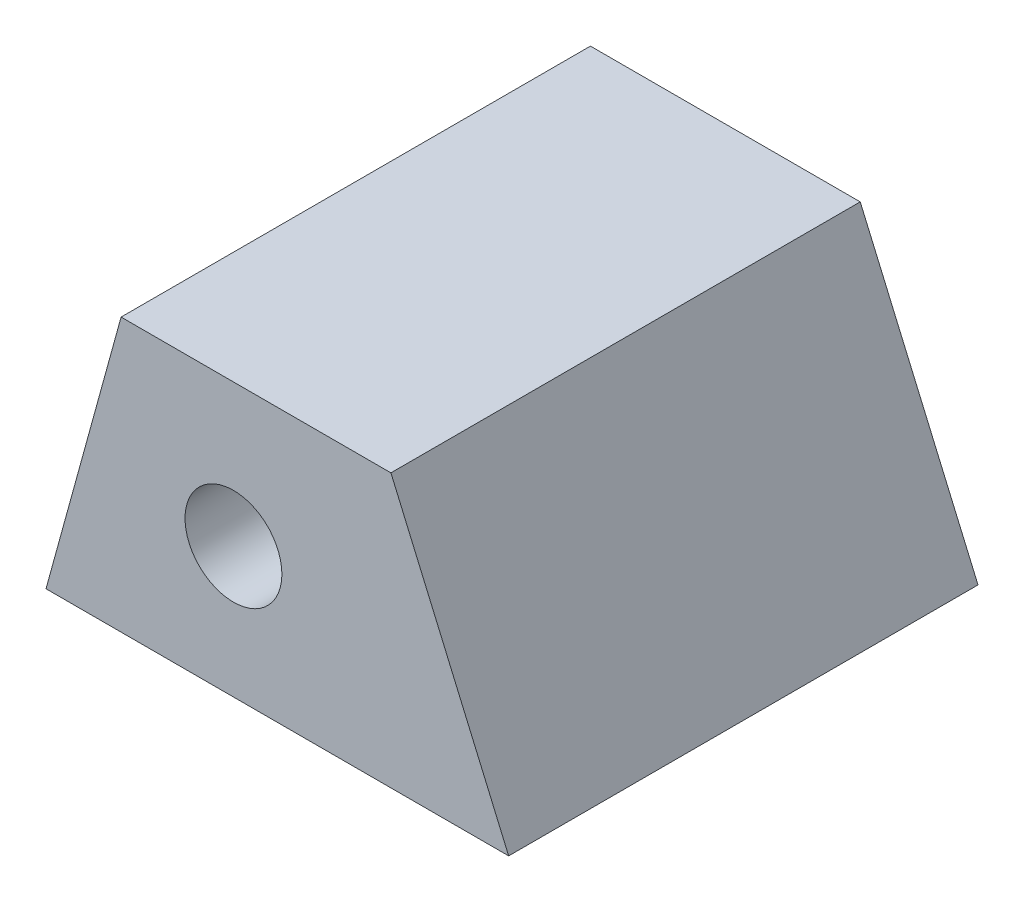
ISO-10303-21;
HEADER;
FILE_DESCRIPTION(('STEP AP214'),'2;1');
FILE_NAME('part.step','',(''),(''),'','','');
FILE_SCHEMA(('AUTOMOTIVE_DESIGN { 1 0 10303 214 1 1 1 1 }'));
ENDSEC;
DATA;
#1=APPLICATION_CONTEXT('core data for automotive mechanical design processes');
#2=APPLICATION_PROTOCOL_DEFINITION('international standard','automotive_design',2000,#1);
#3=PRODUCT_CONTEXT('',#1,'mechanical');
#4=PRODUCT('Part','Part','',(#3));
#5=PRODUCT_RELATED_PRODUCT_CATEGORY('part','',(#4));
#6=PRODUCT_DEFINITION_FORMATION('','',#4);
#7=PRODUCT_DEFINITION_CONTEXT('part definition',#1,'design');
#8=PRODUCT_DEFINITION('design','',#6,#7);
#9=PRODUCT_DEFINITION_SHAPE('','',#8);
#10=(LENGTH_UNIT() NAMED_UNIT(*) SI_UNIT(.MILLI.,.METRE.));
#11=(NAMED_UNIT(*) PLANE_ANGLE_UNIT() SI_UNIT($,.RADIAN.));
#12=(NAMED_UNIT(*) SI_UNIT($,.STERADIAN.) SOLID_ANGLE_UNIT());
#13=UNCERTAINTY_MEASURE_WITH_UNIT(LENGTH_MEASURE(1.E-05),#10,'distance_accuracy_value','');
#14=(GEOMETRIC_REPRESENTATION_CONTEXT(3) GLOBAL_UNCERTAINTY_ASSIGNED_CONTEXT((#13)) GLOBAL_UNIT_ASSIGNED_CONTEXT((#10,
#11,#12)) REPRESENTATION_CONTEXT('',''));
#15=CARTESIAN_POINT('',(0.,0.,0.));
#16=DIRECTION('',(0.,0.,1.));
#17=DIRECTION('',(1.,0.,0.));
#18=AXIS2_PLACEMENT_3D('',#15,#16,#17);
#19=CARTESIAN_POINT('',(19.7161368004572,0.,20.));
#20=DIRECTION('',(0.,1.,0.));
#21=DIRECTION('',(0.,0.,1.));
#22=AXIS2_PLACEMENT_3D('',#19,#20,#21);
#23=PLANE('',#22);
#24=DIRECTION('',(1.,0.,0.));
#25=VECTOR('',#24,1.);
#26=CARTESIAN_POINT('',(19.7161368004572,0.,0.));
#27=LINE('',#26,#25);
#28=CARTESIAN_POINT('',(0.,0.,0.));
#29=VERTEX_POINT('',#28);
#30=CARTESIAN_POINT('',(19.7161368004572,0.,0.));
#31=VERTEX_POINT('',#30);
#32=EDGE_CURVE('E121',#29,#31,#27,.T.);
#33=ORIENTED_EDGE('',*,*,#32,.T.);
#34=DIRECTION('',(0.,0.,-1.));
#35=VECTOR('',#34,1.);
#36=CARTESIAN_POINT('',(19.7161368004572,0.,20.));
#37=LINE('',#36,#35);
#38=CARTESIAN_POINT('',(19.7161368004572,0.,20.));
#39=VERTEX_POINT('',#38);
#40=EDGE_CURVE('E11',#39,#31,#37,.T.);
#41=ORIENTED_EDGE('',*,*,#40,.F.);
#42=DIRECTION('',(1.,0.,0.));
#43=VECTOR('',#42,1.);
#44=CARTESIAN_POINT('',(19.7161368004572,0.,20.));
#45=LINE('',#44,#43);
#46=CARTESIAN_POINT('',(0.,0.,20.));
#47=VERTEX_POINT('',#46);
#48=EDGE_CURVE('E102',#47,#39,#45,.T.);
#49=ORIENTED_EDGE('',*,*,#48,.F.);
#50=DIRECTION('',(0.,0.,-1.));
#51=VECTOR('',#50,1.);
#52=CARTESIAN_POINT('',(0.,0.,20.));
#53=LINE('',#52,#51);
#54=EDGE_CURVE('E117',#47,#29,#53,.T.);
#55=ORIENTED_EDGE('',*,*,#54,.T.);
#56=EDGE_LOOP('',(#33,#41,#49,#55));
#57=FACE_BOUND('',#56,.T.);
#58=ADVANCED_FACE('F41',(#57),#23,.F.);
#59=CARTESIAN_POINT('',(14.6975677339688,11.628019174026,20.));
#60=DIRECTION('',(-0.918137658570681,-0.39626158016435,0.));
#61=DIRECTION('',(0.39626158016435,-0.918137658570681,0.));
#62=AXIS2_PLACEMENT_3D('',#59,#60,#61);
#63=PLANE('',#62);
#64=DIRECTION('',(-0.39626158016435,0.918137658570681,0.));
#65=VECTOR('',#64,1.);
#66=CARTESIAN_POINT('',(14.6975677339688,11.628019174026,0.));
#67=LINE('',#66,#65);
#68=CARTESIAN_POINT('',(14.6975677339688,11.628019174026,0.));
#69=VERTEX_POINT('',#68);
#70=EDGE_CURVE('E107',#31,#69,#67,.T.);
#71=ORIENTED_EDGE('',*,*,#70,.T.);
#72=DIRECTION('',(0.,0.,-1.));
#73=VECTOR('',#72,1.);
#74=CARTESIAN_POINT('',(14.6975677339688,11.628019174026,20.));
#75=LINE('',#74,#73);
#76=CARTESIAN_POINT('',(14.6975677339688,11.628019174026,20.));
#77=VERTEX_POINT('',#76);
#78=EDGE_CURVE('E51',#77,#69,#75,.T.);
#79=ORIENTED_EDGE('',*,*,#78,.F.);
#80=DIRECTION('',(-0.39626158016435,0.918137658570681,0.));
#81=VECTOR('',#80,1.);
#82=CARTESIAN_POINT('',(14.6975677339688,11.628019174026,20.));
#83=LINE('',#82,#81);
#84=EDGE_CURVE('E97',#39,#77,#83,.T.);
#85=ORIENTED_EDGE('',*,*,#84,.F.);
#86=ORIENTED_EDGE('',*,*,#40,.T.);
#87=EDGE_LOOP('',(#71,#79,#85,#86));
#88=FACE_BOUND('',#87,.T.);
#89=ADVANCED_FACE('F106',(#88),#63,.F.);
#90=CARTESIAN_POINT('',(3.20005322264179,11.628019174026,20.));
#91=DIRECTION('',(0.,-1.,0.));
#92=DIRECTION('',(0.,0.,-1.));
#93=AXIS2_PLACEMENT_3D('',#90,#91,#92);
#94=PLANE('',#93);
#95=DIRECTION('',(-1.,0.,0.));
#96=VECTOR('',#95,1.);
#97=CARTESIAN_POINT('',(3.20005322264179,11.628019174026,0.));
#98=LINE('',#97,#96);
#99=CARTESIAN_POINT('',(3.20005322264179,11.628019174026,0.));
#100=VERTEX_POINT('',#99);
#101=EDGE_CURVE('E83',#69,#100,#98,.T.);
#102=ORIENTED_EDGE('',*,*,#101,.T.);
#103=DIRECTION('',(0.,0.,-1.));
#104=VECTOR('',#103,1.);
#105=CARTESIAN_POINT('',(3.20005322264179,11.628019174026,20.));
#106=LINE('',#105,#104);
#107=CARTESIAN_POINT('',(3.20005322264179,11.628019174026,20.));
#108=VERTEX_POINT('',#107);
#109=EDGE_CURVE('E109',#108,#100,#106,.T.);
#110=ORIENTED_EDGE('',*,*,#109,.F.);
#111=DIRECTION('',(-1.,0.,0.));
#112=VECTOR('',#111,1.);
#113=CARTESIAN_POINT('',(3.20005322264179,11.628019174026,20.));
#114=LINE('',#113,#112);
#115=EDGE_CURVE('E100',#77,#108,#114,.T.);
#116=ORIENTED_EDGE('',*,*,#115,.F.);
#117=ORIENTED_EDGE('',*,*,#78,.T.);
#118=EDGE_LOOP('',(#102,#110,#116,#117));
#119=FACE_BOUND('',#118,.T.);
#120=ADVANCED_FACE('F111',(#119),#94,.F.);
#121=CARTESIAN_POINT('',(0.,0.,20.));
#122=DIRECTION('',(0.964155601878166,-0.265337474486647,0.));
#123=DIRECTION('',(0.265337474486647,0.964155601878166,0.));
#124=AXIS2_PLACEMENT_3D('',#121,#122,#123);
#125=PLANE('',#124);
#126=DIRECTION('',(-0.265337474486647,-0.964155601878166,0.));
#127=VECTOR('',#126,1.);
#128=CARTESIAN_POINT('',(0.,0.,0.));
#129=LINE('',#128,#127);
#130=EDGE_CURVE('E89',#100,#29,#129,.T.);
#131=ORIENTED_EDGE('',*,*,#130,.T.);
#132=ORIENTED_EDGE('',*,*,#54,.F.);
#133=DIRECTION('',(-0.265337474486647,-0.964155601878166,0.));
#134=VECTOR('',#133,1.);
#135=CARTESIAN_POINT('',(0.,0.,20.));
#136=LINE('',#135,#134);
#137=EDGE_CURVE('E62',#108,#47,#136,.T.);
#138=ORIENTED_EDGE('',*,*,#137,.F.);
#139=ORIENTED_EDGE('',*,*,#109,.T.);
#140=EDGE_LOOP('',(#131,#132,#138,#139));
#141=FACE_BOUND('',#140,.T.);
#142=ADVANCED_FACE('F132',(#141),#125,.F.);
#143=CARTESIAN_POINT('',(0.,0.,20.));
#144=DIRECTION('',(0.,0.,-1.));
#145=DIRECTION('',(-1.,0.,0.));
#146=AXIS2_PLACEMENT_3D('',#143,#144,#145);
#147=PLANE('',#146);
#148=CARTESIAN_POINT('',(7.98823849714836,5.56407622832467,20.));
#149=DIRECTION('',(0.,0.,1.));
#150=DIRECTION('',(1.,0.,0.));
#151=AXIS2_PLACEMENT_3D('',#148,#149,#150);
#152=CIRCLE('',#151,2.06415715591322);
#153=CARTESIAN_POINT('',(10.0523956530616,5.56407622832467,20.));
#154=VERTEX_POINT('',#153);
#155=EDGE_CURVE('E140',#154,#154,#152,.T.);
#156=ORIENTED_EDGE('',*,*,#155,.F.);
#157=EDGE_LOOP('',(#156));
#158=FACE_BOUND('',#157,.T.);
#159=ORIENTED_EDGE('',*,*,#48,.T.);
#160=ORIENTED_EDGE('',*,*,#84,.T.);
#161=ORIENTED_EDGE('',*,*,#115,.T.);
#162=ORIENTED_EDGE('',*,*,#137,.T.);
#163=EDGE_LOOP('',(#159,#160,#161,#162));
#164=FACE_BOUND('',#163,.T.);
#165=ADVANCED_FACE('F98',(#158,#164),#147,.F.);
#166=CARTESIAN_POINT('',(0.,0.,0.));
#167=DIRECTION('',(0.,0.,-1.));
#168=DIRECTION('',(-1.,0.,0.));
#169=AXIS2_PLACEMENT_3D('',#166,#167,#168);
#170=PLANE('',#169);
#171=CARTESIAN_POINT('',(7.98823849714836,5.56407622832467,0.));
#172=DIRECTION('',(0.,0.,-1.));
#173=DIRECTION('',(-1.,0.,0.));
#174=AXIS2_PLACEMENT_3D('',#171,#172,#173);
#175=CIRCLE('',#174,2.06415715591322);
#176=CARTESIAN_POINT('',(5.92408134123514,5.56407622832467,0.));
#177=VERTEX_POINT('',#176);
#178=EDGE_CURVE('E44',#177,#177,#175,.T.);
#179=ORIENTED_EDGE('',*,*,#178,.F.);
#180=EDGE_LOOP('',(#179));
#181=FACE_BOUND('',#180,.T.);
#182=ORIENTED_EDGE('',*,*,#32,.F.);
#183=ORIENTED_EDGE('',*,*,#130,.F.);
#184=ORIENTED_EDGE('',*,*,#101,.F.);
#185=ORIENTED_EDGE('',*,*,#70,.F.);
#186=EDGE_LOOP('',(#182,#183,#184,#185));
#187=FACE_BOUND('',#186,.T.);
#188=ADVANCED_FACE('F135',(#181,#187),#170,.T.);
#189=CARTESIAN_POINT('',(7.98823849714836,5.56407622832467,-9.));
#190=DIRECTION('',(0.,0.,1.));
#191=DIRECTION('',(1.,0.,0.));
#192=AXIS2_PLACEMENT_3D('',#189,#190,#191);
#193=CYLINDRICAL_SURFACE('',#192,2.06415715591322);
#194=ORIENTED_EDGE('',*,*,#178,.T.);
#195=EDGE_LOOP('',(#194));
#196=FACE_BOUND('',#195,.T.);
#197=ORIENTED_EDGE('',*,*,#155,.T.);
#198=EDGE_LOOP('',(#197));
#199=FACE_BOUND('',#198,.T.);
#200=ADVANCED_FACE('F148',(#196,#199),#193,.F.);
#201=CLOSED_SHELL('',(#58,#89,#120,#142,#165,#188,#200));
#202=MANIFOLD_SOLID_BREP('B2',#201);
#203=ADVANCED_BREP_SHAPE_REPRESENTATION('',(#18,#202),#14);
#204=SHAPE_DEFINITION_REPRESENTATION(#9,#203);
ENDSEC;
END-ISO-10303-21;
